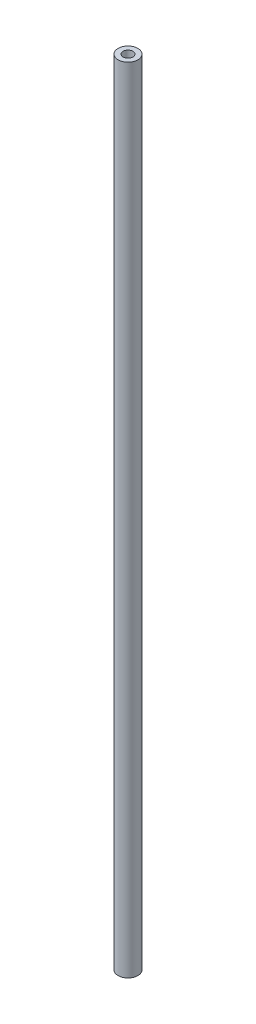
ISO-10303-21;
HEADER;
FILE_DESCRIPTION(('STEP AP214'),'2;1');
FILE_NAME('part.step','',(''),(''),'','','');
FILE_SCHEMA(('AUTOMOTIVE_DESIGN { 1 0 10303 214 1 1 1 1 }'));
ENDSEC;
DATA;
#1=APPLICATION_CONTEXT('core data for automotive mechanical design processes');
#2=APPLICATION_PROTOCOL_DEFINITION('international standard','automotive_design',2000,#1);
#3=PRODUCT_CONTEXT('',#1,'mechanical');
#4=PRODUCT('Part','Part','',(#3));
#5=PRODUCT_RELATED_PRODUCT_CATEGORY('part','',(#4));
#6=PRODUCT_DEFINITION_FORMATION('','',#4);
#7=PRODUCT_DEFINITION_CONTEXT('part definition',#1,'design');
#8=PRODUCT_DEFINITION('design','',#6,#7);
#9=PRODUCT_DEFINITION_SHAPE('','',#8);
#10=(LENGTH_UNIT() NAMED_UNIT(*) SI_UNIT(.MILLI.,.METRE.));
#11=(NAMED_UNIT(*) PLANE_ANGLE_UNIT() SI_UNIT($,.RADIAN.));
#12=(NAMED_UNIT(*) SI_UNIT($,.STERADIAN.) SOLID_ANGLE_UNIT());
#13=UNCERTAINTY_MEASURE_WITH_UNIT(LENGTH_MEASURE(1.E-05),#10,'distance_accuracy_value','');
#14=(GEOMETRIC_REPRESENTATION_CONTEXT(3) GLOBAL_UNCERTAINTY_ASSIGNED_CONTEXT((#13)) GLOBAL_UNIT_ASSIGNED_CONTEXT((#10,
#11,#12)) REPRESENTATION_CONTEXT('',''));
#15=CARTESIAN_POINT('',(0.,0.,0.));
#16=DIRECTION('',(0.,0.,1.));
#17=DIRECTION('',(1.,0.,0.));
#18=AXIS2_PLACEMENT_3D('',#15,#16,#17);
#19=CARTESIAN_POINT('',(0.,2000.,0.));
#20=DIRECTION('',(0.,1.,0.));
#21=DIRECTION('',(0.,0.,1.));
#22=AXIS2_PLACEMENT_3D('',#19,#20,#21);
#23=PLANE('',#22);
#24=CARTESIAN_POINT('',(0.,2000.,0.));
#25=DIRECTION('',(0.,1.,0.));
#26=DIRECTION('',(0.,0.,1.));
#27=AXIS2_PLACEMENT_3D('',#24,#25,#26);
#28=CIRCLE('',#27,25.);
#29=CARTESIAN_POINT('',(0.,2000.,25.));
#30=VERTEX_POINT('',#29);
#31=EDGE_CURVE('E10',#30,#30,#28,.T.);
#32=ORIENTED_EDGE('',*,*,#31,.T.);
#33=EDGE_LOOP('',(#32));
#34=FACE_BOUND('',#33,.T.);
#35=CARTESIAN_POINT('',(0.,2000.,0.));
#36=DIRECTION('',(0.,1.,0.));
#37=DIRECTION('',(0.,0.,1.));
#38=AXIS2_PLACEMENT_3D('',#35,#36,#37);
#39=CIRCLE('',#38,12.5);
#40=CARTESIAN_POINT('',(0.,2000.,12.5));
#41=VERTEX_POINT('',#40);
#42=EDGE_CURVE('E52',#41,#41,#39,.T.);
#43=ORIENTED_EDGE('',*,*,#42,.F.);
#44=EDGE_LOOP('',(#43));
#45=FACE_BOUND('',#44,.T.);
#46=ADVANCED_FACE('F39',(#34,#45),#23,.T.);
#47=CARTESIAN_POINT('',(0.,0.,0.));
#48=DIRECTION('',(0.,1.,0.));
#49=DIRECTION('',(0.,0.,1.));
#50=AXIS2_PLACEMENT_3D('',#47,#48,#49);
#51=PLANE('',#50);
#52=CARTESIAN_POINT('',(0.,0.,0.));
#53=DIRECTION('',(0.,1.,0.));
#54=DIRECTION('',(0.,0.,1.));
#55=AXIS2_PLACEMENT_3D('',#52,#53,#54);
#56=CIRCLE('',#55,25.);
#57=CARTESIAN_POINT('',(0.,0.,25.));
#58=VERTEX_POINT('',#57);
#59=EDGE_CURVE('E43',#58,#58,#56,.T.);
#60=ORIENTED_EDGE('',*,*,#59,.F.);
#61=EDGE_LOOP('',(#60));
#62=FACE_BOUND('',#61,.T.);
#63=CARTESIAN_POINT('',(0.,0.,0.));
#64=DIRECTION('',(0.,1.,0.));
#65=DIRECTION('',(0.,0.,1.));
#66=AXIS2_PLACEMENT_3D('',#63,#64,#65);
#67=CIRCLE('',#66,12.5);
#68=CARTESIAN_POINT('',(0.,0.,12.5));
#69=VERTEX_POINT('',#68);
#70=EDGE_CURVE('E54',#69,#69,#67,.T.);
#71=ORIENTED_EDGE('',*,*,#70,.T.);
#72=EDGE_LOOP('',(#71));
#73=FACE_BOUND('',#72,.T.);
#74=ADVANCED_FACE('F66',(#62,#73),#51,.F.);
#75=CARTESIAN_POINT('',(0.,2000.,0.));
#76=DIRECTION('',(0.,-1.,0.));
#77=DIRECTION('',(0.,0.,-1.));
#78=AXIS2_PLACEMENT_3D('',#75,#76,#77);
#79=CYLINDRICAL_SURFACE('',#78,25.);
#80=ORIENTED_EDGE('',*,*,#31,.F.);
#81=EDGE_LOOP('',(#80));
#82=FACE_BOUND('',#81,.T.);
#83=ORIENTED_EDGE('',*,*,#59,.T.);
#84=EDGE_LOOP('',(#83));
#85=FACE_BOUND('',#84,.T.);
#86=ADVANCED_FACE('F41',(#82,#85),#79,.T.);
#87=CARTESIAN_POINT('',(0.,2000.,0.));
#88=DIRECTION('',(0.,-1.,0.));
#89=DIRECTION('',(0.,0.,-1.));
#90=AXIS2_PLACEMENT_3D('',#87,#88,#89);
#91=CYLINDRICAL_SURFACE('',#90,12.5);
#92=ORIENTED_EDGE('',*,*,#42,.T.);
#93=EDGE_LOOP('',(#92));
#94=FACE_BOUND('',#93,.T.);
#95=ORIENTED_EDGE('',*,*,#70,.F.);
#96=EDGE_LOOP('',(#95));
#97=FACE_BOUND('',#96,.T.);
#98=ADVANCED_FACE('F62',(#94,#97),#91,.F.);
#99=CLOSED_SHELL('',(#46,#74,#86,#98));
#100=MANIFOLD_SOLID_BREP('B2',#99);
#101=ADVANCED_BREP_SHAPE_REPRESENTATION('',(#18,#100),#14);
#102=SHAPE_DEFINITION_REPRESENTATION(#9,#101);
ENDSEC;
END-ISO-10303-21;
